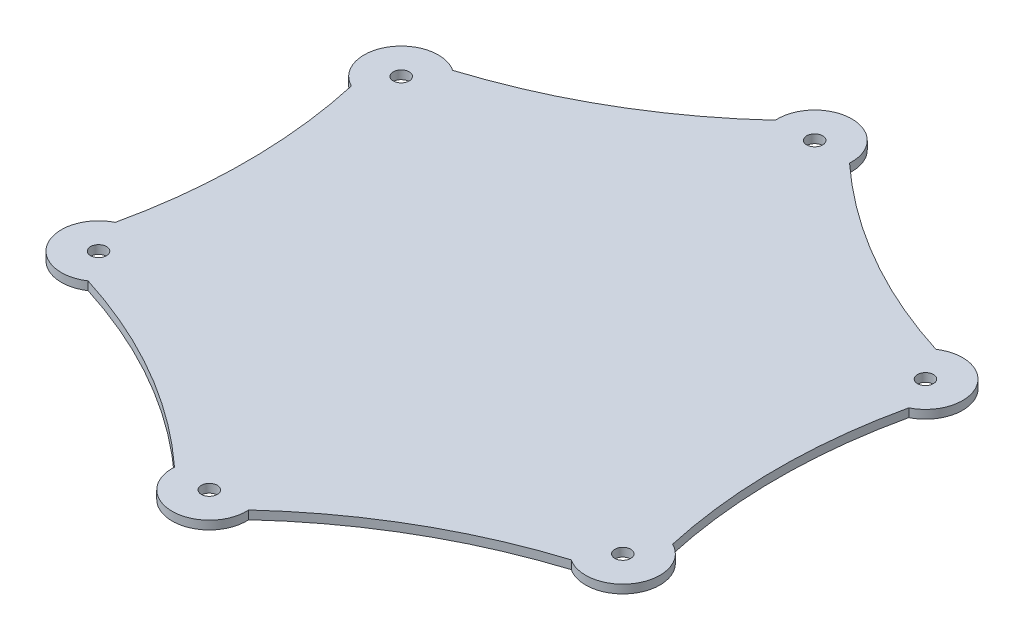
ISO-10303-21;
HEADER;
FILE_DESCRIPTION(('STEP AP214'),'2;1');
FILE_NAME('part.step','',(''),(''),'','','');
FILE_SCHEMA(('AUTOMOTIVE_DESIGN { 1 0 10303 214 1 1 1 1 }'));
ENDSEC;
DATA;
#1=APPLICATION_CONTEXT('core data for automotive mechanical design processes');
#2=APPLICATION_PROTOCOL_DEFINITION('international standard','automotive_design',2000,#1);
#3=PRODUCT_CONTEXT('',#1,'mechanical');
#4=PRODUCT('Part','Part','',(#3));
#5=PRODUCT_RELATED_PRODUCT_CATEGORY('part','',(#4));
#6=PRODUCT_DEFINITION_FORMATION('','',#4);
#7=PRODUCT_DEFINITION_CONTEXT('part definition',#1,'design');
#8=PRODUCT_DEFINITION('design','',#6,#7);
#9=PRODUCT_DEFINITION_SHAPE('','',#8);
#10=(LENGTH_UNIT() NAMED_UNIT(*) SI_UNIT(.MILLI.,.METRE.));
#11=(NAMED_UNIT(*) PLANE_ANGLE_UNIT() SI_UNIT($,.RADIAN.));
#12=(NAMED_UNIT(*) SI_UNIT($,.STERADIAN.) SOLID_ANGLE_UNIT());
#13=UNCERTAINTY_MEASURE_WITH_UNIT(LENGTH_MEASURE(1.E-05),#10,'distance_accuracy_value','');
#14=(GEOMETRIC_REPRESENTATION_CONTEXT(3) GLOBAL_UNCERTAINTY_ASSIGNED_CONTEXT((#13)) GLOBAL_UNIT_ASSIGNED_CONTEXT((#10,
#11,#12)) REPRESENTATION_CONTEXT('',''));
#15=CARTESIAN_POINT('',(0.,0.,0.));
#16=DIRECTION('',(0.,0.,1.));
#17=DIRECTION('',(1.,0.,0.));
#18=AXIS2_PLACEMENT_3D('',#15,#16,#17);
#19=CARTESIAN_POINT('',(-151.76085178711,1.6,-3.15025783237388E-12));
#20=DIRECTION('',(0.,-1.,0.));
#21=DIRECTION('',(0.,0.,-1.));
#22=AXIS2_PLACEMENT_3D('',#19,#20,#21);
#23=CYLINDRICAL_SURFACE('',#22,101.735635507727);
#24=CARTESIAN_POINT('',(-151.76085178711,0.,-3.15025783237388E-12));
#25=DIRECTION('',(0.,1.,0.));
#26=DIRECTION('',(0.,0.,1.));
#27=AXIS2_PLACEMENT_3D('',#24,#25,#26);
#28=CIRCLE('',#27,101.735635507727);
#29=CARTESIAN_POINT('',(-52.4846046111256,0.,22.2343490755602));
#30=VERTEX_POINT('',#29);
#31=CARTESIAN_POINT('',(-52.484604611125,0.,-22.2343490755615));
#32=VERTEX_POINT('',#31);
#33=EDGE_CURVE('E168',#30,#32,#28,.T.);
#34=ORIENTED_EDGE('',*,*,#33,.F.);
#35=DIRECTION('',(0.,-1.,0.));
#36=VECTOR('',#35,1.);
#37=CARTESIAN_POINT('',(-52.4846046111256,1.6,22.2343490755602));
#38=LINE('',#37,#36);
#39=CARTESIAN_POINT('',(-52.4846046111256,1.6,22.2343490755602));
#40=VERTEX_POINT('',#39);
#41=EDGE_CURVE('E11',#40,#30,#38,.T.);
#42=ORIENTED_EDGE('',*,*,#41,.F.);
#43=CARTESIAN_POINT('',(-151.76085178711,1.6,-3.15025783237388E-12));
#44=DIRECTION('',(0.,1.,0.));
#45=DIRECTION('',(0.,0.,1.));
#46=AXIS2_PLACEMENT_3D('',#43,#44,#45);
#47=CIRCLE('',#46,101.735635507727);
#48=CARTESIAN_POINT('',(-52.484604611125,1.6,-22.2343490755615));
#49=VERTEX_POINT('',#48);
#50=EDGE_CURVE('E218',#40,#49,#47,.T.);
#51=ORIENTED_EDGE('',*,*,#50,.T.);
#52=DIRECTION('',(0.,-1.,0.));
#53=VECTOR('',#52,1.);
#54=CARTESIAN_POINT('',(-52.484604611125,1.6,-22.2343490755615));
#55=LINE('',#54,#53);
#56=EDGE_CURVE('E94',#49,#32,#55,.T.);
#57=ORIENTED_EDGE('',*,*,#56,.T.);
#58=EDGE_LOOP('',(#34,#42,#51,#57));
#59=FACE_BOUND('',#58,.T.);
#60=ADVANCED_FACE('F32',(#59),#23,.F.);
#61=CARTESIAN_POINT('',(-49.3634480157139,1.6,28.4999999999993));
#62=DIRECTION('',(0.,-1.,0.));
#63=DIRECTION('',(0.,0.,-1.));
#64=AXIS2_PLACEMENT_3D('',#61,#62,#63);
#65=CYLINDRICAL_SURFACE('',#64,7.0000000000004);
#66=CARTESIAN_POINT('',(-49.3634480157139,0.,28.4999999999993));
#67=DIRECTION('',(0.,1.,0.));
#68=DIRECTION('',(0.,0.,1.));
#69=AXIS2_PLACEMENT_3D('',#66,#67,#68);
#70=CIRCLE('',#69,7.0000000000004);
#71=CARTESIAN_POINT('',(-45.4978134416102,0.,34.3358263630348));
#72=VERTEX_POINT('',#71);
#73=EDGE_CURVE('E171',#30,#72,#70,.T.);
#74=ORIENTED_EDGE('',*,*,#73,.T.);
#75=DIRECTION('',(0.,-1.,0.));
#76=VECTOR('',#75,1.);
#77=CARTESIAN_POINT('',(-45.4978134416102,1.6,34.3358263630348));
#78=LINE('',#77,#76);
#79=CARTESIAN_POINT('',(-45.4978134416102,1.6,34.3358263630348));
#80=VERTEX_POINT('',#79);
#81=EDGE_CURVE('E40',#80,#72,#78,.T.);
#82=ORIENTED_EDGE('',*,*,#81,.F.);
#83=CARTESIAN_POINT('',(-49.3634480157139,1.6,28.4999999999993));
#84=DIRECTION('',(0.,1.,0.));
#85=DIRECTION('',(0.,0.,1.));
#86=AXIS2_PLACEMENT_3D('',#83,#84,#85);
#87=CIRCLE('',#86,7.0000000000004);
#88=EDGE_CURVE('E258',#40,#80,#87,.T.);
#89=ORIENTED_EDGE('',*,*,#88,.F.);
#90=ORIENTED_EDGE('',*,*,#41,.T.);
#91=EDGE_LOOP('',(#74,#82,#89,#90));
#92=FACE_BOUND('',#91,.T.);
#93=ADVANCED_FACE('F242',(#92),#65,.T.);
#94=CARTESIAN_POINT('',(-75.8804258935574,1.6,131.428752947601));
#95=DIRECTION('',(0.,-1.,0.));
#96=DIRECTION('',(0.,0.,-1.));
#97=AXIS2_PLACEMENT_3D('',#94,#95,#96);
#98=CYLINDRICAL_SURFACE('',#97,101.735635507727);
#99=CARTESIAN_POINT('',(-75.8804258935574,0.,131.428752947601));
#100=DIRECTION('',(0.,1.,0.));
#101=DIRECTION('',(0.,0.,1.));
#102=AXIS2_PLACEMENT_3D('',#99,#100,#101);
#103=CIRCLE('',#102,101.735635507727);
#104=CARTESIAN_POINT('',(-6.98679116951645,0.,56.5701754385968));
#105=VERTEX_POINT('',#104);
#106=EDGE_CURVE('E174',#105,#72,#103,.T.);
#107=ORIENTED_EDGE('',*,*,#106,.F.);
#108=DIRECTION('',(0.,-1.,0.));
#109=VECTOR('',#108,1.);
#110=CARTESIAN_POINT('',(-6.98679116951645,1.6,56.5701754385968));
#111=LINE('',#110,#109);
#112=CARTESIAN_POINT('',(-6.98679116951645,1.6,56.5701754385968));
#113=VERTEX_POINT('',#112);
#114=EDGE_CURVE('E232',#113,#105,#111,.T.);
#115=ORIENTED_EDGE('',*,*,#114,.F.);
#116=CARTESIAN_POINT('',(-75.8804258935574,1.6,131.428752947601));
#117=DIRECTION('',(0.,1.,0.));
#118=DIRECTION('',(0.,0.,1.));
#119=AXIS2_PLACEMENT_3D('',#116,#117,#118);
#120=CIRCLE('',#119,101.735635507727);
#121=EDGE_CURVE('E239',#113,#80,#120,.T.);
#122=ORIENTED_EDGE('',*,*,#121,.T.);
#123=ORIENTED_EDGE('',*,*,#81,.T.);
#124=EDGE_LOOP('',(#107,#115,#122,#123));
#125=FACE_BOUND('',#124,.T.);
#126=ADVANCED_FACE('F237',(#125),#98,.F.);
#127=CARTESIAN_POINT('',(-9.49671168527097E-13,1.6,57.0000000000004));
#128=DIRECTION('',(0.,-1.,0.));
#129=DIRECTION('',(0.,0.,-1.));
#130=AXIS2_PLACEMENT_3D('',#127,#128,#129);
#131=CYLINDRICAL_SURFACE('',#130,7.0000000000004);
#132=CARTESIAN_POINT('',(-9.49671168527097E-13,0.,57.0000000000004));
#133=DIRECTION('',(0.,1.,0.));
#134=DIRECTION('',(0.,0.,1.));
#135=AXIS2_PLACEMENT_3D('',#132,#133,#134);
#136=CIRCLE('',#135,7.0000000000004);
#137=CARTESIAN_POINT('',(6.9867911695146,0.,56.570175438597));
#138=VERTEX_POINT('',#137);
#139=EDGE_CURVE('E177',#105,#138,#136,.T.);
#140=ORIENTED_EDGE('',*,*,#139,.T.);
#141=DIRECTION('',(0.,-1.,0.));
#142=VECTOR('',#141,1.);
#143=CARTESIAN_POINT('',(6.9867911695146,1.6,56.570175438597));
#144=LINE('',#143,#142);
#145=CARTESIAN_POINT('',(6.9867911695146,1.6,56.570175438597));
#146=VERTEX_POINT('',#145);
#147=EDGE_CURVE('E230',#146,#138,#144,.T.);
#148=ORIENTED_EDGE('',*,*,#147,.F.);
#149=CARTESIAN_POINT('',(-9.49671168527097E-13,1.6,57.0000000000004));
#150=DIRECTION('',(0.,1.,0.));
#151=DIRECTION('',(0.,0.,1.));
#152=AXIS2_PLACEMENT_3D('',#149,#150,#151);
#153=CIRCLE('',#152,7.0000000000004);
#154=EDGE_CURVE('E254',#113,#146,#153,.T.);
#155=ORIENTED_EDGE('',*,*,#154,.F.);
#156=ORIENTED_EDGE('',*,*,#114,.T.);
#157=EDGE_LOOP('',(#140,#148,#155,#156));
#158=FACE_BOUND('',#157,.T.);
#159=ADVANCED_FACE('F251',(#158),#131,.T.);
#160=CARTESIAN_POINT('',(75.8804258935529,1.6,131.428752947603));
#161=DIRECTION('',(0.,-1.,0.));
#162=DIRECTION('',(0.,0.,-1.));
#163=AXIS2_PLACEMENT_3D('',#160,#161,#162);
#164=CYLINDRICAL_SURFACE('',#163,101.735635507727);
#165=CARTESIAN_POINT('',(75.8804258935529,0.,131.428752947603));
#166=DIRECTION('',(0.,1.,0.));
#167=DIRECTION('',(0.,0.,1.));
#168=AXIS2_PLACEMENT_3D('',#165,#166,#167);
#169=CIRCLE('',#168,101.735635507727);
#170=CARTESIAN_POINT('',(45.4978134416092,0.,34.3358263630363));
#171=VERTEX_POINT('',#170);
#172=EDGE_CURVE('E180',#171,#138,#169,.T.);
#173=ORIENTED_EDGE('',*,*,#172,.F.);
#174=DIRECTION('',(0.,-1.,0.));
#175=VECTOR('',#174,1.);
#176=CARTESIAN_POINT('',(45.4978134416092,1.6,34.3358263630363));
#177=LINE('',#176,#175);
#178=CARTESIAN_POINT('',(45.4978134416092,1.6,34.3358263630363));
#179=VERTEX_POINT('',#178);
#180=EDGE_CURVE('E228',#179,#171,#177,.T.);
#181=ORIENTED_EDGE('',*,*,#180,.F.);
#182=CARTESIAN_POINT('',(75.8804258935529,1.6,131.428752947603));
#183=DIRECTION('',(0.,1.,0.));
#184=DIRECTION('',(0.,0.,1.));
#185=AXIS2_PLACEMENT_3D('',#182,#183,#184);
#186=CIRCLE('',#185,101.735635507727);
#187=EDGE_CURVE('E256',#179,#146,#186,.T.);
#188=ORIENTED_EDGE('',*,*,#187,.T.);
#189=ORIENTED_EDGE('',*,*,#147,.T.);
#190=EDGE_LOOP('',(#173,#181,#188,#189));
#191=FACE_BOUND('',#190,.T.);
#192=ADVANCED_FACE('F287',(#191),#164,.F.);
#193=CARTESIAN_POINT('',(49.363448015713,1.6,28.5000000000009));
#194=DIRECTION('',(0.,-1.,0.));
#195=DIRECTION('',(0.,0.,-1.));
#196=AXIS2_PLACEMENT_3D('',#193,#194,#195);
#197=CYLINDRICAL_SURFACE('',#196,7.0000000000004);
#198=CARTESIAN_POINT('',(49.363448015713,0.,28.5000000000009));
#199=DIRECTION('',(0.,1.,0.));
#200=DIRECTION('',(0.,0.,1.));
#201=AXIS2_PLACEMENT_3D('',#198,#199,#200);
#202=CIRCLE('',#201,7.0000000000004);
#203=CARTESIAN_POINT('',(52.4846046111248,0.,22.234349075562));
#204=VERTEX_POINT('',#203);
#205=EDGE_CURVE('E183',#171,#204,#202,.T.);
#206=ORIENTED_EDGE('',*,*,#205,.T.);
#207=DIRECTION('',(0.,-1.,0.));
#208=VECTOR('',#207,1.);
#209=CARTESIAN_POINT('',(52.4846046111248,1.6,22.234349075562));
#210=LINE('',#209,#208);
#211=CARTESIAN_POINT('',(52.4846046111248,1.6,22.234349075562));
#212=VERTEX_POINT('',#211);
#213=EDGE_CURVE('E226',#212,#204,#210,.T.);
#214=ORIENTED_EDGE('',*,*,#213,.F.);
#215=CARTESIAN_POINT('',(49.363448015713,1.6,28.5000000000009));
#216=DIRECTION('',(0.,1.,0.));
#217=DIRECTION('',(0.,0.,1.));
#218=AXIS2_PLACEMENT_3D('',#215,#216,#217);
#219=CIRCLE('',#218,7.0000000000004);
#220=EDGE_CURVE('E264',#179,#212,#219,.T.);
#221=ORIENTED_EDGE('',*,*,#220,.F.);
#222=ORIENTED_EDGE('',*,*,#180,.T.);
#223=EDGE_LOOP('',(#206,#214,#221,#222));
#224=FACE_BOUND('',#223,.T.);
#225=ADVANCED_FACE('F290',(#224),#197,.T.);
#226=CARTESIAN_POINT('',(151.76085178711,1.6,2.08166817117217E-12));
#227=DIRECTION('',(0.,-1.,0.));
#228=DIRECTION('',(0.,0.,-1.));
#229=AXIS2_PLACEMENT_3D('',#226,#227,#228);
#230=CYLINDRICAL_SURFACE('',#229,101.735635507727);
#231=CARTESIAN_POINT('',(151.76085178711,0.,2.08166817117217E-12));
#232=DIRECTION('',(0.,1.,0.));
#233=DIRECTION('',(0.,0.,1.));
#234=AXIS2_PLACEMENT_3D('',#231,#232,#233);
#235=CIRCLE('',#234,101.735635507727);
#236=CARTESIAN_POINT('',(52.4846046111254,0.,-22.2343490755606));
#237=VERTEX_POINT('',#236);
#238=EDGE_CURVE('E186',#237,#204,#235,.T.);
#239=ORIENTED_EDGE('',*,*,#238,.F.);
#240=DIRECTION('',(0.,-1.,0.));
#241=VECTOR('',#240,1.);
#242=CARTESIAN_POINT('',(52.4846046111254,1.6,-22.2343490755606));
#243=LINE('',#242,#241);
#244=CARTESIAN_POINT('',(52.4846046111254,1.6,-22.2343490755606));
#245=VERTEX_POINT('',#244);
#246=EDGE_CURVE('E224',#245,#237,#243,.T.);
#247=ORIENTED_EDGE('',*,*,#246,.F.);
#248=CARTESIAN_POINT('',(151.76085178711,1.6,2.08166817117217E-12));
#249=DIRECTION('',(0.,1.,0.));
#250=DIRECTION('',(0.,0.,1.));
#251=AXIS2_PLACEMENT_3D('',#248,#249,#250);
#252=CIRCLE('',#251,101.735635507727);
#253=EDGE_CURVE('E266',#245,#212,#252,.T.);
#254=ORIENTED_EDGE('',*,*,#253,.T.);
#255=ORIENTED_EDGE('',*,*,#213,.T.);
#256=EDGE_LOOP('',(#239,#247,#254,#255));
#257=FACE_BOUND('',#256,.T.);
#258=ADVANCED_FACE('F294',(#257),#230,.F.);
#259=CARTESIAN_POINT('',(49.3634480157137,1.6,-28.4999999999996));
#260=DIRECTION('',(0.,-1.,0.));
#261=DIRECTION('',(0.,0.,-1.));
#262=AXIS2_PLACEMENT_3D('',#259,#260,#261);
#263=CYLINDRICAL_SURFACE('',#262,7.0000000000004);
#264=CARTESIAN_POINT('',(49.3634480157137,0.,-28.4999999999996));
#265=DIRECTION('',(0.,1.,0.));
#266=DIRECTION('',(0.,0.,1.));
#267=AXIS2_PLACEMENT_3D('',#264,#265,#266);
#268=CIRCLE('',#267,7.0000000000004);
#269=CARTESIAN_POINT('',(45.49781344161,0.,-34.3358263630351));
#270=VERTEX_POINT('',#269);
#271=EDGE_CURVE('E189',#237,#270,#268,.T.);
#272=ORIENTED_EDGE('',*,*,#271,.T.);
#273=DIRECTION('',(0.,-1.,0.));
#274=VECTOR('',#273,1.);
#275=CARTESIAN_POINT('',(45.49781344161,1.6,-34.3358263630351));
#276=LINE('',#275,#274);
#277=CARTESIAN_POINT('',(45.49781344161,1.6,-34.3358263630351));
#278=VERTEX_POINT('',#277);
#279=EDGE_CURVE('E222',#278,#270,#276,.T.);
#280=ORIENTED_EDGE('',*,*,#279,.F.);
#281=CARTESIAN_POINT('',(49.3634480157137,1.6,-28.4999999999996));
#282=DIRECTION('',(0.,1.,0.));
#283=DIRECTION('',(0.,0.,1.));
#284=AXIS2_PLACEMENT_3D('',#281,#282,#283);
#285=CIRCLE('',#284,7.0000000000004);
#286=EDGE_CURVE('E269',#245,#278,#285,.T.);
#287=ORIENTED_EDGE('',*,*,#286,.F.);
#288=ORIENTED_EDGE('',*,*,#246,.T.);
#289=EDGE_LOOP('',(#272,#280,#287,#288));
#290=FACE_BOUND('',#289,.T.);
#291=ADVANCED_FACE('F298',(#290),#263,.T.);
#292=CARTESIAN_POINT('',(75.8804258935565,1.6,-131.428752947601));
#293=DIRECTION('',(0.,-1.,0.));
#294=DIRECTION('',(0.,0.,-1.));
#295=AXIS2_PLACEMENT_3D('',#292,#293,#294);
#296=CYLINDRICAL_SURFACE('',#295,101.735635507727);
#297=CARTESIAN_POINT('',(75.8804258935565,0.,-131.428752947601));
#298=DIRECTION('',(0.,1.,0.));
#299=DIRECTION('',(0.,0.,1.));
#300=AXIS2_PLACEMENT_3D('',#297,#298,#299);
#301=CIRCLE('',#300,101.735635507727);
#302=CARTESIAN_POINT('',(6.98679116951608,0.,-56.5701754385968));
#303=VERTEX_POINT('',#302);
#304=EDGE_CURVE('E192',#303,#270,#301,.T.);
#305=ORIENTED_EDGE('',*,*,#304,.F.);
#306=DIRECTION('',(0.,-1.,0.));
#307=VECTOR('',#306,1.);
#308=CARTESIAN_POINT('',(6.98679116951608,1.6,-56.5701754385968));
#309=LINE('',#308,#307);
#310=CARTESIAN_POINT('',(6.98679116951608,1.6,-56.5701754385968));
#311=VERTEX_POINT('',#310);
#312=EDGE_CURVE('E143',#311,#303,#309,.T.);
#313=ORIENTED_EDGE('',*,*,#312,.F.);
#314=CARTESIAN_POINT('',(75.8804258935565,1.6,-131.428752947601));
#315=DIRECTION('',(0.,1.,0.));
#316=DIRECTION('',(0.,0.,1.));
#317=AXIS2_PLACEMENT_3D('',#314,#315,#316);
#318=CIRCLE('',#317,101.735635507727);
#319=EDGE_CURVE('E132',#311,#278,#318,.T.);
#320=ORIENTED_EDGE('',*,*,#319,.T.);
#321=ORIENTED_EDGE('',*,*,#279,.T.);
#322=EDGE_LOOP('',(#305,#313,#320,#321));
#323=FACE_BOUND('',#322,.T.);
#324=ADVANCED_FACE('F272',(#323),#296,.F.);
#325=CARTESIAN_POINT('',(5.40285087287642E-13,1.6,-57.0000000000004));
#326=DIRECTION('',(0.,-1.,0.));
#327=DIRECTION('',(0.,0.,-1.));
#328=AXIS2_PLACEMENT_3D('',#325,#326,#327);
#329=CYLINDRICAL_SURFACE('',#328,7.00000000000044);
#330=CARTESIAN_POINT('',(5.40285087287642E-13,0.,-57.0000000000004));
#331=DIRECTION('',(0.,1.,0.));
#332=DIRECTION('',(0.,0.,1.));
#333=AXIS2_PLACEMENT_3D('',#330,#331,#332);
#334=CIRCLE('',#333,7.00000000000044);
#335=CARTESIAN_POINT('',(-6.98679116951501,0.,-56.570175438597));
#336=VERTEX_POINT('',#335);
#337=EDGE_CURVE('E139',#303,#336,#334,.T.);
#338=ORIENTED_EDGE('',*,*,#337,.T.);
#339=DIRECTION('',(0.,-1.,0.));
#340=VECTOR('',#339,1.);
#341=CARTESIAN_POINT('',(-6.98679116951501,1.6,-56.570175438597));
#342=LINE('',#341,#340);
#343=CARTESIAN_POINT('',(-6.98679116951501,1.6,-56.570175438597));
#344=VERTEX_POINT('',#343);
#345=EDGE_CURVE('E136',#344,#336,#342,.T.);
#346=ORIENTED_EDGE('',*,*,#345,.F.);
#347=CARTESIAN_POINT('',(5.40285087287642E-13,1.6,-57.0000000000004));
#348=DIRECTION('',(0.,1.,0.));
#349=DIRECTION('',(0.,0.,1.));
#350=AXIS2_PLACEMENT_3D('',#347,#348,#349);
#351=CIRCLE('',#350,7.00000000000044);
#352=EDGE_CURVE('E125',#311,#344,#351,.T.);
#353=ORIENTED_EDGE('',*,*,#352,.F.);
#354=ORIENTED_EDGE('',*,*,#312,.T.);
#355=EDGE_LOOP('',(#338,#346,#353,#354));
#356=FACE_BOUND('',#355,.T.);
#357=ADVANCED_FACE('F137',(#356),#329,.T.);
#358=CARTESIAN_POINT('',(-75.8804258935538,1.6,-131.428752947603));
#359=DIRECTION('',(0.,-1.,0.));
#360=DIRECTION('',(0.,0.,-1.));
#361=AXIS2_PLACEMENT_3D('',#358,#359,#360);
#362=CYLINDRICAL_SURFACE('',#361,101.735635507727);
#363=CARTESIAN_POINT('',(-75.8804258935538,0.,-131.428752947603));
#364=DIRECTION('',(0.,1.,0.));
#365=DIRECTION('',(0.,0.,1.));
#366=AXIS2_PLACEMENT_3D('',#363,#364,#365);
#367=CIRCLE('',#366,101.735635507727);
#368=CARTESIAN_POINT('',(-45.4978134416094,0.,-34.335826363036));
#369=VERTEX_POINT('',#368);
#370=EDGE_CURVE('E196',#369,#336,#367,.T.);
#371=ORIENTED_EDGE('',*,*,#370,.F.);
#372=DIRECTION('',(0.,-1.,0.));
#373=VECTOR('',#372,1.);
#374=CARTESIAN_POINT('',(-45.4978134416094,1.6,-34.335826363036));
#375=LINE('',#374,#373);
#376=CARTESIAN_POINT('',(-45.4978134416094,1.6,-34.335826363036));
#377=VERTEX_POINT('',#376);
#378=EDGE_CURVE('E87',#377,#369,#375,.T.);
#379=ORIENTED_EDGE('',*,*,#378,.F.);
#380=CARTESIAN_POINT('',(-75.8804258935538,1.6,-131.428752947603));
#381=DIRECTION('',(0.,1.,0.));
#382=DIRECTION('',(0.,0.,1.));
#383=AXIS2_PLACEMENT_3D('',#380,#381,#382);
#384=CIRCLE('',#383,101.735635507727);
#385=EDGE_CURVE('E130',#377,#344,#384,.T.);
#386=ORIENTED_EDGE('',*,*,#385,.T.);
#387=ORIENTED_EDGE('',*,*,#345,.T.);
#388=EDGE_LOOP('',(#371,#379,#386,#387));
#389=FACE_BOUND('',#388,.T.);
#390=ADVANCED_FACE('F145',(#389),#362,.F.);
#391=CARTESIAN_POINT('',(49.3634480157137,1.6,-28.4999999999996));
#392=DIRECTION('',(0.,-1.,0.));
#393=DIRECTION('',(0.,0.,-1.));
#394=AXIS2_PLACEMENT_3D('',#391,#392,#393);
#395=CYLINDRICAL_SURFACE('',#394,1.5);
#396=CARTESIAN_POINT('',(49.3634480157137,1.6,-28.4999999999996));
#397=DIRECTION('',(0.,1.,0.));
#398=DIRECTION('',(0.,0.,1.));
#399=AXIS2_PLACEMENT_3D('',#396,#397,#398);
#400=CIRCLE('',#399,1.5);
#401=CARTESIAN_POINT('',(49.3634480157137,1.6,-26.9999999999996));
#402=VERTEX_POINT('',#401);
#403=EDGE_CURVE('E162',#402,#402,#400,.T.);
#404=ORIENTED_EDGE('',*,*,#403,.T.);
#405=EDGE_LOOP('',(#404));
#406=FACE_BOUND('',#405,.T.);
#407=CARTESIAN_POINT('',(49.3634480157137,0.,-28.4999999999996));
#408=DIRECTION('',(0.,1.,0.));
#409=DIRECTION('',(0.,0.,1.));
#410=AXIS2_PLACEMENT_3D('',#407,#408,#409);
#411=CIRCLE('',#410,1.5);
#412=CARTESIAN_POINT('',(49.3634480157137,0.,-26.9999999999996));
#413=VERTEX_POINT('',#412);
#414=EDGE_CURVE('E212',#413,#413,#411,.T.);
#415=ORIENTED_EDGE('',*,*,#414,.F.);
#416=EDGE_LOOP('',(#415));
#417=FACE_BOUND('',#416,.T.);
#418=ADVANCED_FACE('F309',(#406,#417),#395,.F.);
#419=CARTESIAN_POINT('',(49.363448015713,1.6,28.5000000000009));
#420=DIRECTION('',(0.,-1.,0.));
#421=DIRECTION('',(0.,0.,-1.));
#422=AXIS2_PLACEMENT_3D('',#419,#420,#421);
#423=CYLINDRICAL_SURFACE('',#422,1.5);
#424=CARTESIAN_POINT('',(49.363448015713,1.6,28.5000000000009));
#425=DIRECTION('',(0.,1.,0.));
#426=DIRECTION('',(0.,0.,1.));
#427=AXIS2_PLACEMENT_3D('',#424,#425,#426);
#428=CIRCLE('',#427,1.5);
#429=CARTESIAN_POINT('',(49.363448015713,1.6,30.0000000000009));
#430=VERTEX_POINT('',#429);
#431=EDGE_CURVE('E159',#430,#430,#428,.T.);
#432=ORIENTED_EDGE('',*,*,#431,.T.);
#433=EDGE_LOOP('',(#432));
#434=FACE_BOUND('',#433,.T.);
#435=CARTESIAN_POINT('',(49.363448015713,0.,28.5000000000009));
#436=DIRECTION('',(0.,1.,0.));
#437=DIRECTION('',(0.,0.,1.));
#438=AXIS2_PLACEMENT_3D('',#435,#436,#437);
#439=CIRCLE('',#438,1.5);
#440=CARTESIAN_POINT('',(49.363448015713,0.,30.0000000000009));
#441=VERTEX_POINT('',#440);
#442=EDGE_CURVE('E209',#441,#441,#439,.T.);
#443=ORIENTED_EDGE('',*,*,#442,.F.);
#444=EDGE_LOOP('',(#443));
#445=FACE_BOUND('',#444,.T.);
#446=ADVANCED_FACE('F324',(#434,#445),#423,.F.);
#447=CARTESIAN_POINT('',(-9.29811783123569E-13,1.6,57.0000000000004));
#448=DIRECTION('',(0.,-1.,0.));
#449=DIRECTION('',(0.,0.,-1.));
#450=AXIS2_PLACEMENT_3D('',#447,#448,#449);
#451=CYLINDRICAL_SURFACE('',#450,1.5);
#452=CARTESIAN_POINT('',(-9.29811783123569E-13,1.6,57.0000000000004));
#453=DIRECTION('',(0.,1.,0.));
#454=DIRECTION('',(0.,0.,1.));
#455=AXIS2_PLACEMENT_3D('',#452,#453,#454);
#456=CIRCLE('',#455,1.5);
#457=CARTESIAN_POINT('',(-9.29811783123569E-13,1.6,58.5000000000004));
#458=VERTEX_POINT('',#457);
#459=EDGE_CURVE('E156',#458,#458,#456,.T.);
#460=ORIENTED_EDGE('',*,*,#459,.T.);
#461=EDGE_LOOP('',(#460));
#462=FACE_BOUND('',#461,.T.);
#463=CARTESIAN_POINT('',(-9.29811783123569E-13,0.,57.0000000000004));
#464=DIRECTION('',(0.,1.,0.));
#465=DIRECTION('',(0.,0.,1.));
#466=AXIS2_PLACEMENT_3D('',#463,#464,#465);
#467=CIRCLE('',#466,1.5);
#468=CARTESIAN_POINT('',(-9.29811783123569E-13,0.,58.5000000000004));
#469=VERTEX_POINT('',#468);
#470=EDGE_CURVE('E206',#469,#469,#467,.T.);
#471=ORIENTED_EDGE('',*,*,#470,.F.);
#472=EDGE_LOOP('',(#471));
#473=FACE_BOUND('',#472,.T.);
#474=ADVANCED_FACE('F320',(#462,#473),#451,.F.);
#475=CARTESIAN_POINT('',(-49.3634480157139,1.6,28.4999999999993));
#476=DIRECTION('',(0.,-1.,0.));
#477=DIRECTION('',(0.,0.,-1.));
#478=AXIS2_PLACEMENT_3D('',#475,#476,#477);
#479=CYLINDRICAL_SURFACE('',#478,1.5);
#480=CARTESIAN_POINT('',(-49.3634480157139,1.6,28.4999999999993));
#481=DIRECTION('',(0.,1.,0.));
#482=DIRECTION('',(0.,0.,1.));
#483=AXIS2_PLACEMENT_3D('',#480,#481,#482);
#484=CIRCLE('',#483,1.5);
#485=CARTESIAN_POINT('',(-49.3634480157139,1.6,29.9999999999993));
#486=VERTEX_POINT('',#485);
#487=EDGE_CURVE('E153',#486,#486,#484,.T.);
#488=ORIENTED_EDGE('',*,*,#487,.T.);
#489=EDGE_LOOP('',(#488));
#490=FACE_BOUND('',#489,.T.);
#491=CARTESIAN_POINT('',(-49.3634480157139,0.,28.4999999999993));
#492=DIRECTION('',(0.,1.,0.));
#493=DIRECTION('',(0.,0.,1.));
#494=AXIS2_PLACEMENT_3D('',#491,#492,#493);
#495=CIRCLE('',#494,1.5);
#496=CARTESIAN_POINT('',(-49.3634480157139,0.,29.9999999999993));
#497=VERTEX_POINT('',#496);
#498=EDGE_CURVE('E203',#497,#497,#495,.T.);
#499=ORIENTED_EDGE('',*,*,#498,.F.);
#500=EDGE_LOOP('',(#499));
#501=FACE_BOUND('',#500,.T.);
#502=ADVANCED_FACE('F316',(#490,#501),#479,.F.);
#503=CARTESIAN_POINT('',(-49.3634480157132,1.6,-28.5000000000006));
#504=DIRECTION('',(0.,-1.,0.));
#505=DIRECTION('',(0.,0.,-1.));
#506=AXIS2_PLACEMENT_3D('',#503,#504,#505);
#507=CYLINDRICAL_SURFACE('',#506,1.5);
#508=CARTESIAN_POINT('',(-49.3634480157132,1.6,-28.5000000000006));
#509=DIRECTION('',(0.,1.,0.));
#510=DIRECTION('',(0.,0.,1.));
#511=AXIS2_PLACEMENT_3D('',#508,#509,#510);
#512=CIRCLE('',#511,1.5);
#513=CARTESIAN_POINT('',(-49.3634480157132,1.6,-27.0000000000006));
#514=VERTEX_POINT('',#513);
#515=EDGE_CURVE('E147',#514,#514,#512,.T.);
#516=ORIENTED_EDGE('',*,*,#515,.T.);
#517=EDGE_LOOP('',(#516));
#518=FACE_BOUND('',#517,.T.);
#519=CARTESIAN_POINT('',(-49.3634480157132,0.,-28.5000000000006));
#520=DIRECTION('',(0.,1.,0.));
#521=DIRECTION('',(0.,0.,1.));
#522=AXIS2_PLACEMENT_3D('',#519,#520,#521);
#523=CIRCLE('',#522,1.5);
#524=CARTESIAN_POINT('',(-49.3634480157132,0.,-27.0000000000006));
#525=VERTEX_POINT('',#524);
#526=EDGE_CURVE('E200',#525,#525,#523,.T.);
#527=ORIENTED_EDGE('',*,*,#526,.F.);
#528=EDGE_LOOP('',(#527));
#529=FACE_BOUND('',#528,.T.);
#530=ADVANCED_FACE('F313',(#518,#529),#507,.F.);
#531=CARTESIAN_POINT('',(-49.3634480157132,1.6,-28.5000000000006));
#532=DIRECTION('',(0.,-1.,0.));
#533=DIRECTION('',(0.,0.,-1.));
#534=AXIS2_PLACEMENT_3D('',#531,#532,#533);
#535=CYLINDRICAL_SURFACE('',#534,7.00000000000046);
#536=CARTESIAN_POINT('',(-49.3634480157132,0.,-28.5000000000006));
#537=DIRECTION('',(0.,1.,0.));
#538=DIRECTION('',(0.,0.,1.));
#539=AXIS2_PLACEMENT_3D('',#536,#537,#538);
#540=CIRCLE('',#539,7.00000000000046);
#541=EDGE_CURVE('E198',#369,#32,#540,.T.);
#542=ORIENTED_EDGE('',*,*,#541,.T.);
#543=ORIENTED_EDGE('',*,*,#56,.F.);
#544=CARTESIAN_POINT('',(-49.3634480157132,1.6,-28.5000000000006));
#545=DIRECTION('',(0.,1.,0.));
#546=DIRECTION('',(0.,0.,1.));
#547=AXIS2_PLACEMENT_3D('',#544,#545,#546);
#548=CIRCLE('',#547,7.00000000000046);
#549=EDGE_CURVE('E48',#377,#49,#548,.T.);
#550=ORIENTED_EDGE('',*,*,#549,.F.);
#551=ORIENTED_EDGE('',*,*,#378,.T.);
#552=EDGE_LOOP('',(#542,#543,#550,#551));
#553=FACE_BOUND('',#552,.T.);
#554=ADVANCED_FACE('F275',(#553),#535,.T.);
#555=CARTESIAN_POINT('',(5.40285087287642E-13,1.6,-57.0000000000004));
#556=DIRECTION('',(0.,-1.,0.));
#557=DIRECTION('',(0.,0.,-1.));
#558=AXIS2_PLACEMENT_3D('',#555,#556,#557);
#559=CYLINDRICAL_SURFACE('',#558,1.5);
#560=CARTESIAN_POINT('',(5.40285087287642E-13,1.6,-57.0000000000004));
#561=DIRECTION('',(0.,1.,0.));
#562=DIRECTION('',(0.,0.,1.));
#563=AXIS2_PLACEMENT_3D('',#560,#561,#562);
#564=CIRCLE('',#563,1.5);
#565=CARTESIAN_POINT('',(5.40285087287642E-13,1.6,-55.5000000000004));
#566=VERTEX_POINT('',#565);
#567=EDGE_CURVE('E165',#566,#566,#564,.T.);
#568=ORIENTED_EDGE('',*,*,#567,.T.);
#569=EDGE_LOOP('',(#568));
#570=FACE_BOUND('',#569,.T.);
#571=CARTESIAN_POINT('',(5.40285087287642E-13,0.,-57.0000000000004));
#572=DIRECTION('',(0.,1.,0.));
#573=DIRECTION('',(0.,0.,1.));
#574=AXIS2_PLACEMENT_3D('',#571,#572,#573);
#575=CIRCLE('',#574,1.5);
#576=CARTESIAN_POINT('',(5.40285087287642E-13,0.,-55.5000000000004));
#577=VERTEX_POINT('',#576);
#578=EDGE_CURVE('E215',#577,#577,#575,.T.);
#579=ORIENTED_EDGE('',*,*,#578,.F.);
#580=EDGE_LOOP('',(#579));
#581=FACE_BOUND('',#580,.T.);
#582=ADVANCED_FACE('F312',(#570,#581),#559,.F.);
#583=CARTESIAN_POINT('',(-119.328531535129,1.6,-0.284014066124893));
#584=DIRECTION('',(0.,1.,0.));
#585=DIRECTION('',(0.,0.,1.));
#586=AXIS2_PLACEMENT_3D('',#583,#584,#585);
#587=PLANE('',#586);
#588=ORIENTED_EDGE('',*,*,#50,.F.);
#589=ORIENTED_EDGE('',*,*,#88,.T.);
#590=ORIENTED_EDGE('',*,*,#121,.F.);
#591=ORIENTED_EDGE('',*,*,#154,.T.);
#592=ORIENTED_EDGE('',*,*,#187,.F.);
#593=ORIENTED_EDGE('',*,*,#220,.T.);
#594=ORIENTED_EDGE('',*,*,#253,.F.);
#595=ORIENTED_EDGE('',*,*,#286,.T.);
#596=ORIENTED_EDGE('',*,*,#319,.F.);
#597=ORIENTED_EDGE('',*,*,#352,.T.);
#598=ORIENTED_EDGE('',*,*,#385,.F.);
#599=ORIENTED_EDGE('',*,*,#549,.T.);
#600=EDGE_LOOP('',(#588,#589,#590,#591,#592,#593,#594,#595,#596,#597,#598,#599));
#601=FACE_BOUND('',#600,.T.);
#602=ORIENTED_EDGE('',*,*,#515,.F.);
#603=EDGE_LOOP('',(#602));
#604=FACE_BOUND('',#603,.T.);
#605=ORIENTED_EDGE('',*,*,#487,.F.);
#606=EDGE_LOOP('',(#605));
#607=FACE_BOUND('',#606,.T.);
#608=ORIENTED_EDGE('',*,*,#459,.F.);
#609=EDGE_LOOP('',(#608));
#610=FACE_BOUND('',#609,.T.);
#611=ORIENTED_EDGE('',*,*,#431,.F.);
#612=EDGE_LOOP('',(#611));
#613=FACE_BOUND('',#612,.T.);
#614=ORIENTED_EDGE('',*,*,#403,.F.);
#615=EDGE_LOOP('',(#614));
#616=FACE_BOUND('',#615,.T.);
#617=ORIENTED_EDGE('',*,*,#567,.F.);
#618=EDGE_LOOP('',(#617));
#619=FACE_BOUND('',#618,.T.);
#620=ADVANCED_FACE('F127',(#601,#604,#607,#610,#613,#616,#619),#587,.T.);
#621=CARTESIAN_POINT('',(-119.328531535129,0.,-0.284014066124893));
#622=DIRECTION('',(0.,1.,0.));
#623=DIRECTION('',(0.,0.,1.));
#624=AXIS2_PLACEMENT_3D('',#621,#622,#623);
#625=PLANE('',#624);
#626=ORIENTED_EDGE('',*,*,#33,.T.);
#627=ORIENTED_EDGE('',*,*,#541,.F.);
#628=ORIENTED_EDGE('',*,*,#370,.T.);
#629=ORIENTED_EDGE('',*,*,#337,.F.);
#630=ORIENTED_EDGE('',*,*,#304,.T.);
#631=ORIENTED_EDGE('',*,*,#271,.F.);
#632=ORIENTED_EDGE('',*,*,#238,.T.);
#633=ORIENTED_EDGE('',*,*,#205,.F.);
#634=ORIENTED_EDGE('',*,*,#172,.T.);
#635=ORIENTED_EDGE('',*,*,#139,.F.);
#636=ORIENTED_EDGE('',*,*,#106,.T.);
#637=ORIENTED_EDGE('',*,*,#73,.F.);
#638=EDGE_LOOP('',(#626,#627,#628,#629,#630,#631,#632,#633,#634,#635,#636,#637));
#639=FACE_BOUND('',#638,.T.);
#640=ORIENTED_EDGE('',*,*,#526,.T.);
#641=EDGE_LOOP('',(#640));
#642=FACE_BOUND('',#641,.T.);
#643=ORIENTED_EDGE('',*,*,#498,.T.);
#644=EDGE_LOOP('',(#643));
#645=FACE_BOUND('',#644,.T.);
#646=ORIENTED_EDGE('',*,*,#470,.T.);
#647=EDGE_LOOP('',(#646));
#648=FACE_BOUND('',#647,.T.);
#649=ORIENTED_EDGE('',*,*,#442,.T.);
#650=EDGE_LOOP('',(#649));
#651=FACE_BOUND('',#650,.T.);
#652=ORIENTED_EDGE('',*,*,#414,.T.);
#653=EDGE_LOOP('',(#652));
#654=FACE_BOUND('',#653,.T.);
#655=ORIENTED_EDGE('',*,*,#578,.T.);
#656=EDGE_LOOP('',(#655));
#657=FACE_BOUND('',#656,.T.);
#658=ADVANCED_FACE('F245',(#639,#642,#645,#648,#651,#654,#657),#625,.F.);
#659=CLOSED_SHELL('',(#60,#93,#126,#159,#192,#225,#258,#291,#324,#357,#390,#418,#446,#474,#502,
#530,#554,#582,#620,#658));
#660=MANIFOLD_SOLID_BREP('B2',#659);
#661=ADVANCED_BREP_SHAPE_REPRESENTATION('',(#18,#660),#14);
#662=SHAPE_DEFINITION_REPRESENTATION(#9,#661);
ENDSEC;
END-ISO-10303-21;
